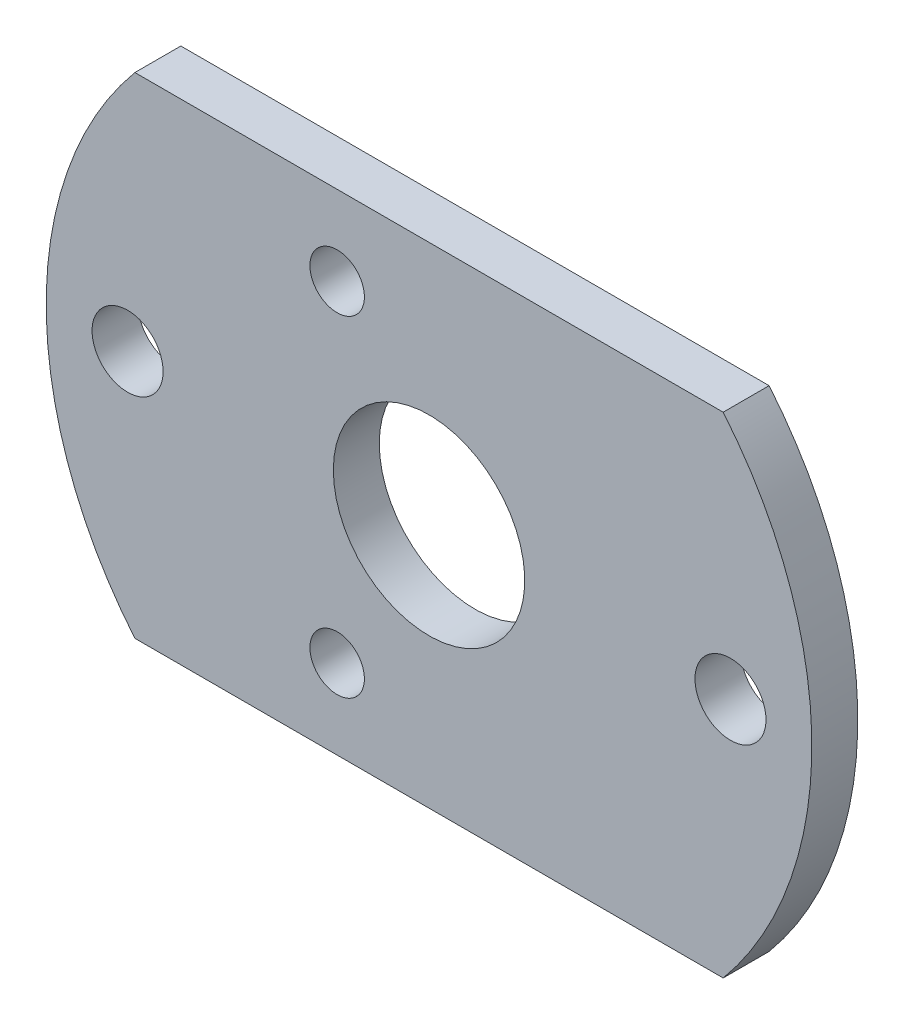
ISO-10303-21;
HEADER;
FILE_DESCRIPTION(('STEP AP214'),'2;1');
FILE_NAME('part.step','',(''),(''),'','','');
FILE_SCHEMA(('AUTOMOTIVE_DESIGN { 1 0 10303 214 1 1 1 1 }'));
ENDSEC;
DATA;
#1=APPLICATION_CONTEXT('core data for automotive mechanical design processes');
#2=APPLICATION_PROTOCOL_DEFINITION('international standard','automotive_design',2000,#1);
#3=PRODUCT_CONTEXT('',#1,'mechanical');
#4=PRODUCT('Part','Part','',(#3));
#5=PRODUCT_RELATED_PRODUCT_CATEGORY('part','',(#4));
#6=PRODUCT_DEFINITION_FORMATION('','',#4);
#7=PRODUCT_DEFINITION_CONTEXT('part definition',#1,'design');
#8=PRODUCT_DEFINITION('design','',#6,#7);
#9=PRODUCT_DEFINITION_SHAPE('','',#8);
#10=(LENGTH_UNIT() NAMED_UNIT(*) SI_UNIT(.MILLI.,.METRE.));
#11=(NAMED_UNIT(*) PLANE_ANGLE_UNIT() SI_UNIT($,.RADIAN.));
#12=(NAMED_UNIT(*) SI_UNIT($,.STERADIAN.) SOLID_ANGLE_UNIT());
#13=UNCERTAINTY_MEASURE_WITH_UNIT(LENGTH_MEASURE(1.E-05),#10,'distance_accuracy_value','');
#14=(GEOMETRIC_REPRESENTATION_CONTEXT(3) GLOBAL_UNCERTAINTY_ASSIGNED_CONTEXT((#13)) GLOBAL_UNIT_ASSIGNED_CONTEXT((#10,
#11,#12)) REPRESENTATION_CONTEXT('',''));
#15=CARTESIAN_POINT('',(0.,0.,0.));
#16=DIRECTION('',(0.,0.,1.));
#17=DIRECTION('',(1.,0.,0.));
#18=AXIS2_PLACEMENT_3D('',#15,#16,#17);
#19=CARTESIAN_POINT('',(0.,0.,1.905));
#20=DIRECTION('',(0.,0.,-1.));
#21=DIRECTION('',(-1.,0.,0.));
#22=AXIS2_PLACEMENT_3D('',#19,#20,#21);
#23=CYLINDRICAL_SURFACE('',#22,15.875);
#24=CARTESIAN_POINT('',(0.,0.,1.905));
#25=DIRECTION('',(0.,0.,1.));
#26=DIRECTION('',(1.,0.,0.));
#27=AXIS2_PLACEMENT_3D('',#24,#25,#26);
#28=CIRCLE('',#27,15.875);
#29=CARTESIAN_POINT('',(-12.1979516723096,10.16,1.905));
#30=VERTEX_POINT('',#29);
#31=CARTESIAN_POINT('',(-12.1979516723096,-10.16,1.905));
#32=VERTEX_POINT('',#31);
#33=EDGE_CURVE('E46',#30,#32,#28,.T.);
#34=ORIENTED_EDGE('',*,*,#33,.F.);
#35=DIRECTION('',(0.,0.,1.));
#36=VECTOR('',#35,1.);
#37=CARTESIAN_POINT('',(-12.1979516723096,10.16,0.));
#38=LINE('',#37,#36);
#39=CARTESIAN_POINT('',(-12.1979516723096,10.16,0.));
#40=VERTEX_POINT('',#39);
#41=EDGE_CURVE('E80',#40,#30,#38,.T.);
#42=ORIENTED_EDGE('',*,*,#41,.F.);
#43=CARTESIAN_POINT('',(0.,0.,0.));
#44=DIRECTION('',(0.,0.,1.));
#45=DIRECTION('',(1.,0.,0.));
#46=AXIS2_PLACEMENT_3D('',#43,#44,#45);
#47=CIRCLE('',#46,15.875);
#48=CARTESIAN_POINT('',(-12.1979516723096,-10.16,0.));
#49=VERTEX_POINT('',#48);
#50=EDGE_CURVE('E89',#40,#49,#47,.T.);
#51=ORIENTED_EDGE('',*,*,#50,.T.);
#52=DIRECTION('',(0.,0.,1.));
#53=VECTOR('',#52,1.);
#54=CARTESIAN_POINT('',(-12.1979516723096,-10.16,0.));
#55=LINE('',#54,#53);
#56=EDGE_CURVE('E129',#49,#32,#55,.T.);
#57=ORIENTED_EDGE('',*,*,#56,.T.);
#58=EDGE_LOOP('',(#34,#42,#51,#57));
#59=FACE_BOUND('',#58,.T.);
#60=ADVANCED_FACE('F37',(#59),#23,.T.);
#61=CARTESIAN_POINT('',(0.,0.,1.905));
#62=DIRECTION('',(0.,0.,1.));
#63=DIRECTION('',(1.,0.,0.));
#64=AXIS2_PLACEMENT_3D('',#61,#62,#63);
#65=PLANE('',#64);
#66=DIRECTION('',(1.,0.,0.));
#67=VECTOR('',#66,1.);
#68=CARTESIAN_POINT('',(-12.1979516723096,10.16,1.905));
#69=LINE('',#68,#67);
#70=CARTESIAN_POINT('',(12.1979516723096,10.16,1.905));
#71=VERTEX_POINT('',#70);
#72=EDGE_CURVE('E53',#30,#71,#69,.T.);
#73=ORIENTED_EDGE('',*,*,#72,.F.);
#74=ORIENTED_EDGE('',*,*,#33,.T.);
#75=DIRECTION('',(-1.,0.,0.));
#76=VECTOR('',#75,1.);
#77=CARTESIAN_POINT('',(-12.1979516723096,-10.16,1.905));
#78=LINE('',#77,#76);
#79=CARTESIAN_POINT('',(12.1979516723096,-10.16,1.905));
#80=VERTEX_POINT('',#79);
#81=EDGE_CURVE('E133',#80,#32,#78,.T.);
#82=ORIENTED_EDGE('',*,*,#81,.F.);
#83=EDGE_CURVE('E11',#80,#71,#28,.T.);
#84=ORIENTED_EDGE('',*,*,#83,.T.);
#85=EDGE_LOOP('',(#73,#74,#82,#84));
#86=FACE_BOUND('',#85,.T.);
#87=CARTESIAN_POINT('',(-3.81,6.858,1.905));
#88=DIRECTION('',(0.,0.,1.));
#89=DIRECTION('',(1.,0.,0.));
#90=AXIS2_PLACEMENT_3D('',#87,#88,#89);
#91=CIRCLE('',#90,1.13029999999999);
#92=CARTESIAN_POINT('',(-2.67970000000001,6.858,1.905));
#93=VERTEX_POINT('',#92);
#94=EDGE_CURVE('E126',#93,#93,#91,.T.);
#95=ORIENTED_EDGE('',*,*,#94,.F.);
#96=EDGE_LOOP('',(#95));
#97=FACE_BOUND('',#96,.T.);
#98=CARTESIAN_POINT('',(-3.81,-6.858,1.905));
#99=DIRECTION('',(0.,0.,1.));
#100=DIRECTION('',(1.,0.,0.));
#101=AXIS2_PLACEMENT_3D('',#98,#99,#100);
#102=CIRCLE('',#101,1.13029999999999);
#103=CARTESIAN_POINT('',(-2.67970000000001,-6.858,1.905));
#104=VERTEX_POINT('',#103);
#105=EDGE_CURVE('E120',#104,#104,#102,.T.);
#106=ORIENTED_EDGE('',*,*,#105,.F.);
#107=EDGE_LOOP('',(#106));
#108=FACE_BOUND('',#107,.T.);
#109=CARTESIAN_POINT('',(-12.5,0.,1.905));
#110=DIRECTION('',(0.,0.,1.));
#111=DIRECTION('',(1.,0.,0.));
#112=AXIS2_PLACEMENT_3D('',#109,#110,#111);
#113=CIRCLE('',#112,1.47319999999999);
#114=CARTESIAN_POINT('',(-11.0268,0.,1.905));
#115=VERTEX_POINT('',#114);
#116=EDGE_CURVE('E114',#115,#115,#113,.T.);
#117=ORIENTED_EDGE('',*,*,#116,.F.);
#118=EDGE_LOOP('',(#117));
#119=FACE_BOUND('',#118,.T.);
#120=CARTESIAN_POINT('',(12.5,0.,1.905));
#121=DIRECTION('',(0.,0.,1.));
#122=DIRECTION('',(1.,0.,0.));
#123=AXIS2_PLACEMENT_3D('',#120,#121,#122);
#124=CIRCLE('',#123,1.47319999999999);
#125=CARTESIAN_POINT('',(13.9732,0.,1.905));
#126=VERTEX_POINT('',#125);
#127=EDGE_CURVE('E108',#126,#126,#124,.T.);
#128=ORIENTED_EDGE('',*,*,#127,.F.);
#129=EDGE_LOOP('',(#128));
#130=FACE_BOUND('',#129,.T.);
#131=CARTESIAN_POINT('',(0.,0.,1.905));
#132=DIRECTION('',(0.,0.,1.));
#133=DIRECTION('',(1.,0.,0.));
#134=AXIS2_PLACEMENT_3D('',#131,#132,#133);
#135=CIRCLE('',#134,3.96875);
#136=CARTESIAN_POINT('',(-3.96875,0.,1.905));
#137=VERTEX_POINT('',#136);
#138=EDGE_CURVE('E96',#137,#137,#135,.T.);
#139=ORIENTED_EDGE('',*,*,#138,.F.);
#140=EDGE_LOOP('',(#139));
#141=FACE_BOUND('',#140,.T.);
#142=ADVANCED_FACE('F140',(#86,#97,#108,#119,#130,#141),#65,.T.);
#143=CARTESIAN_POINT('',(0.,0.,0.));
#144=DIRECTION('',(0.,0.,1.));
#145=DIRECTION('',(1.,0.,0.));
#146=AXIS2_PLACEMENT_3D('',#143,#144,#145);
#147=PLANE('',#146);
#148=CARTESIAN_POINT('',(-3.81,6.858,0.));
#149=DIRECTION('',(0.,0.,1.));
#150=DIRECTION('',(1.,0.,0.));
#151=AXIS2_PLACEMENT_3D('',#148,#149,#150);
#152=CIRCLE('',#151,1.1303);
#153=CARTESIAN_POINT('',(-2.6797,6.858,0.));
#154=VERTEX_POINT('',#153);
#155=EDGE_CURVE('E123',#154,#154,#152,.T.);
#156=ORIENTED_EDGE('',*,*,#155,.T.);
#157=EDGE_LOOP('',(#156));
#158=FACE_BOUND('',#157,.T.);
#159=CARTESIAN_POINT('',(-3.81,-6.858,0.));
#160=DIRECTION('',(0.,0.,1.));
#161=DIRECTION('',(1.,0.,0.));
#162=AXIS2_PLACEMENT_3D('',#159,#160,#161);
#163=CIRCLE('',#162,1.1303);
#164=CARTESIAN_POINT('',(-2.6797,-6.858,0.));
#165=VERTEX_POINT('',#164);
#166=EDGE_CURVE('E117',#165,#165,#163,.T.);
#167=ORIENTED_EDGE('',*,*,#166,.T.);
#168=EDGE_LOOP('',(#167));
#169=FACE_BOUND('',#168,.T.);
#170=CARTESIAN_POINT('',(-12.5,0.,0.));
#171=DIRECTION('',(0.,0.,1.));
#172=DIRECTION('',(1.,0.,0.));
#173=AXIS2_PLACEMENT_3D('',#170,#171,#172);
#174=CIRCLE('',#173,1.4732);
#175=CARTESIAN_POINT('',(-11.0268,0.,0.));
#176=VERTEX_POINT('',#175);
#177=EDGE_CURVE('E111',#176,#176,#174,.T.);
#178=ORIENTED_EDGE('',*,*,#177,.T.);
#179=EDGE_LOOP('',(#178));
#180=FACE_BOUND('',#179,.T.);
#181=CARTESIAN_POINT('',(12.5,0.,0.));
#182=DIRECTION('',(0.,0.,1.));
#183=DIRECTION('',(1.,0.,0.));
#184=AXIS2_PLACEMENT_3D('',#181,#182,#183);
#185=CIRCLE('',#184,1.4732);
#186=CARTESIAN_POINT('',(13.9732,0.,0.));
#187=VERTEX_POINT('',#186);
#188=EDGE_CURVE('E103',#187,#187,#185,.T.);
#189=ORIENTED_EDGE('',*,*,#188,.T.);
#190=EDGE_LOOP('',(#189));
#191=FACE_BOUND('',#190,.T.);
#192=ORIENTED_EDGE('',*,*,#50,.F.);
#193=DIRECTION('',(1.,0.,0.));
#194=VECTOR('',#193,1.);
#195=CARTESIAN_POINT('',(-12.1979516723096,10.16,0.));
#196=LINE('',#195,#194);
#197=CARTESIAN_POINT('',(12.1979516723096,10.16,0.));
#198=VERTEX_POINT('',#197);
#199=EDGE_CURVE('E77',#40,#198,#196,.T.);
#200=ORIENTED_EDGE('',*,*,#199,.T.);
#201=CARTESIAN_POINT('',(12.1979516723096,-10.16,0.));
#202=VERTEX_POINT('',#201);
#203=EDGE_CURVE('E41',#202,#198,#47,.T.);
#204=ORIENTED_EDGE('',*,*,#203,.F.);
#205=DIRECTION('',(-1.,0.,0.));
#206=VECTOR('',#205,1.);
#207=CARTESIAN_POINT('',(-12.1979516723096,-10.16,0.));
#208=LINE('',#207,#206);
#209=EDGE_CURVE('E95',#202,#49,#208,.T.);
#210=ORIENTED_EDGE('',*,*,#209,.T.);
#211=EDGE_LOOP('',(#192,#200,#204,#210));
#212=FACE_BOUND('',#211,.T.);
#213=CARTESIAN_POINT('',(0.,0.,0.));
#214=DIRECTION('',(0.,0.,1.));
#215=DIRECTION('',(1.,0.,0.));
#216=AXIS2_PLACEMENT_3D('',#213,#214,#215);
#217=CIRCLE('',#216,3.96875);
#218=CARTESIAN_POINT('',(-3.96875,0.,0.));
#219=VERTEX_POINT('',#218);
#220=EDGE_CURVE('E98',#219,#219,#217,.T.);
#221=ORIENTED_EDGE('',*,*,#220,.T.);
#222=EDGE_LOOP('',(#221));
#223=FACE_BOUND('',#222,.T.);
#224=ADVANCED_FACE('F93',(#158,#169,#180,#191,#212,#223),#147,.F.);
#225=ORIENTED_EDGE('',*,*,#203,.T.);
#226=DIRECTION('',(0.,0.,1.));
#227=VECTOR('',#226,1.);
#228=CARTESIAN_POINT('',(12.1979516723096,10.16,0.));
#229=LINE('',#228,#227);
#230=EDGE_CURVE('E81',#198,#71,#229,.T.);
#231=ORIENTED_EDGE('',*,*,#230,.T.);
#232=ORIENTED_EDGE('',*,*,#83,.F.);
#233=DIRECTION('',(0.,0.,1.));
#234=VECTOR('',#233,1.);
#235=CARTESIAN_POINT('',(12.1979516723096,-10.16,0.));
#236=LINE('',#235,#234);
#237=EDGE_CURVE('E130',#202,#80,#236,.T.);
#238=ORIENTED_EDGE('',*,*,#237,.F.);
#239=EDGE_LOOP('',(#225,#231,#232,#238));
#240=FACE_BOUND('',#239,.T.);
#241=ADVANCED_FACE('F39',(#240),#23,.T.);
#242=CARTESIAN_POINT('',(0.,0.,1.905));
#243=DIRECTION('',(0.,0.,-1.));
#244=DIRECTION('',(-1.,0.,0.));
#245=AXIS2_PLACEMENT_3D('',#242,#243,#244);
#246=CYLINDRICAL_SURFACE('',#245,3.96875);
#247=CARTESIAN_POINT('',(-3.96875,0.,1.905));
#248=CARTESIAN_POINT('',(-3.96875,0.,1.88515625));
#249=CARTESIAN_POINT('',(-3.96875,0.,1.8653125));
#250=CARTESIAN_POINT('',(-3.96875,0.,1.825625));
#251=CARTESIAN_POINT('',(-3.96875,0.,1.80578125));
#252=CARTESIAN_POINT('',(-3.96875,0.,1.76609375));
#253=CARTESIAN_POINT('',(-3.96875,0.,1.74625));
#254=CARTESIAN_POINT('',(-3.96875,0.,1.7065625));
#255=CARTESIAN_POINT('',(-3.96875,0.,1.68671875));
#256=CARTESIAN_POINT('',(-3.96875,0.,1.64703125));
#257=CARTESIAN_POINT('',(-3.96875,0.,1.6271875));
#258=CARTESIAN_POINT('',(-3.96875,0.,1.5875));
#259=CARTESIAN_POINT('',(-3.96875,0.,1.56765625));
#260=CARTESIAN_POINT('',(-3.96875,0.,1.52796875));
#261=CARTESIAN_POINT('',(-3.96875,0.,1.508125));
#262=CARTESIAN_POINT('',(-3.96875,0.,1.4684375));
#263=CARTESIAN_POINT('',(-3.96875,0.,1.44859375));
#264=CARTESIAN_POINT('',(-3.96875,0.,1.40890625));
#265=CARTESIAN_POINT('',(-3.96875,0.,1.3890625));
#266=CARTESIAN_POINT('',(-3.96875,0.,1.349375));
#267=CARTESIAN_POINT('',(-3.96875,0.,1.32953125));
#268=CARTESIAN_POINT('',(-3.96875,0.,1.28984375));
#269=CARTESIAN_POINT('',(-3.96875,0.,1.27));
#270=CARTESIAN_POINT('',(-3.96875,0.,1.2303125));
#271=CARTESIAN_POINT('',(-3.96875,0.,1.21046875));
#272=CARTESIAN_POINT('',(-3.96875,0.,1.17078125));
#273=CARTESIAN_POINT('',(-3.96875,0.,1.1509375));
#274=CARTESIAN_POINT('',(-3.96875,0.,1.11125));
#275=CARTESIAN_POINT('',(-3.96875,0.,1.09140625));
#276=CARTESIAN_POINT('',(-3.96875,0.,1.05171875));
#277=CARTESIAN_POINT('',(-3.96875,0.,1.031875));
#278=CARTESIAN_POINT('',(-3.96875,0.,0.9921875));
#279=CARTESIAN_POINT('',(-3.96875,0.,0.97234375));
#280=CARTESIAN_POINT('',(-3.96875,0.,0.93265625));
#281=CARTESIAN_POINT('',(-3.96875,0.,0.9128125));
#282=CARTESIAN_POINT('',(-3.96875,0.,0.873125));
#283=CARTESIAN_POINT('',(-3.96875,0.,0.85328125));
#284=CARTESIAN_POINT('',(-3.96875,0.,0.81359375));
#285=CARTESIAN_POINT('',(-3.96875,0.,0.79375));
#286=CARTESIAN_POINT('',(-3.96875,0.,0.7540625));
#287=CARTESIAN_POINT('',(-3.96875,0.,0.73421875));
#288=CARTESIAN_POINT('',(-3.96875,0.,0.69453125));
#289=CARTESIAN_POINT('',(-3.96875,0.,0.6746875));
#290=CARTESIAN_POINT('',(-3.96875,0.,0.635));
#291=CARTESIAN_POINT('',(-3.96875,0.,0.61515625));
#292=CARTESIAN_POINT('',(-3.96875,0.,0.57546875));
#293=CARTESIAN_POINT('',(-3.96875,0.,0.555625));
#294=CARTESIAN_POINT('',(-3.96875,0.,0.5159375));
#295=CARTESIAN_POINT('',(-3.96875,0.,0.49609375));
#296=CARTESIAN_POINT('',(-3.96875,0.,0.45640625));
#297=CARTESIAN_POINT('',(-3.96875,0.,0.4365625));
#298=CARTESIAN_POINT('',(-3.96875,0.,0.396875));
#299=CARTESIAN_POINT('',(-3.96875,0.,0.37703125));
#300=CARTESIAN_POINT('',(-3.96875,0.,0.33734375));
#301=CARTESIAN_POINT('',(-3.96875,0.,0.3175));
#302=CARTESIAN_POINT('',(-3.96875,0.,0.2778125));
#303=CARTESIAN_POINT('',(-3.96875,0.,0.25796875));
#304=CARTESIAN_POINT('',(-3.96875,0.,0.21828125));
#305=CARTESIAN_POINT('',(-3.96875,0.,0.1984375));
#306=CARTESIAN_POINT('',(-3.96875,0.,0.15875));
#307=CARTESIAN_POINT('',(-3.96875,0.,0.13890625));
#308=CARTESIAN_POINT('',(-3.96875,0.,0.09921875));
#309=CARTESIAN_POINT('',(-3.96875,0.,0.0793749999999999));
#310=CARTESIAN_POINT('',(-3.96875,0.,0.0396874999999999));
#311=CARTESIAN_POINT('',(-3.96875,0.,0.01984375));
#312=CARTESIAN_POINT('',(-3.96875,0.,0.));
#313=B_SPLINE_CURVE_WITH_KNOTS('',3,(#247,#248,#249,#250,#251,#252,#253,#254,#255,#256,#257,
#258,#259,#260,#261,#262,#263,#264,#265,#266,#267,#268,#269,#270,#271,#272,#273,#274,#275,#276,
#277,#278,#279,#280,#281,#282,#283,#284,#285,#286,#287,#288,#289,#290,#291,#292,#293,#294,#295,
#296,#297,#298,#299,#300,#301,#302,#303,#304,#305,#306,#307,#308,#309,#310,#311,#312),
.UNSPECIFIED.,.F.,.F.,(4,2,2,2,2,2,2,2,2,2,2,2,2,2,2,2,2,2,2,2,2,2,2,2,2,2,2,2,2,2,2,2,4),(0.,
0.0595312499999999,0.1190625,0.17859375,0.238125,0.29765625,0.3571875,0.41671875,0.47625,
0.53578125,0.5953125,0.65484375,0.714375,0.77390625,0.833437499999999,0.89296875,0.9525,
1.01203125,1.0715625,1.13109375,1.190625,1.25015625,1.3096875,1.36921875,1.42875,1.48828125,
1.5478125,1.60734375,1.666875,1.72640625,1.7859375,1.84546875,1.905),.UNSPECIFIED.);
#314=EDGE_CURVE('BSEAM161',#137,#219,#313,.T.);
#315=ORIENTED_EDGE('',*,*,#138,.T.);
#316=ORIENTED_EDGE('',*,*,#220,.F.);
#317=ORIENTED_EDGE('',*,*,#314,.T.);
#318=ORIENTED_EDGE('',*,*,#314,.F.);
#319=EDGE_LOOP('',(#315,#317,#316,#318));
#320=FACE_BOUND('',#319,.T.);
#321=ADVANCED_FACE('F161',(#320),#246,.F.);
#322=CARTESIAN_POINT('',(12.5,0.,1.905));
#323=DIRECTION('',(0.,0.,1.));
#324=DIRECTION('',(1.,0.,0.));
#325=AXIS2_PLACEMENT_3D('',#322,#323,#324);
#326=CYLINDRICAL_SURFACE('',#325,1.47319999999999);
#327=ORIENTED_EDGE('',*,*,#188,.F.);
#328=EDGE_LOOP('',(#327));
#329=FACE_BOUND('',#328,.T.);
#330=ORIENTED_EDGE('',*,*,#127,.T.);
#331=EDGE_LOOP('',(#330));
#332=FACE_BOUND('',#331,.T.);
#333=ADVANCED_FACE('F166',(#329,#332),#326,.F.);
#334=CARTESIAN_POINT('',(-12.5,0.,1.905));
#335=DIRECTION('',(0.,0.,1.));
#336=DIRECTION('',(1.,0.,0.));
#337=AXIS2_PLACEMENT_3D('',#334,#335,#336);
#338=CYLINDRICAL_SURFACE('',#337,1.47319999999999);
#339=ORIENTED_EDGE('',*,*,#177,.F.);
#340=EDGE_LOOP('',(#339));
#341=FACE_BOUND('',#340,.T.);
#342=ORIENTED_EDGE('',*,*,#116,.T.);
#343=EDGE_LOOP('',(#342));
#344=FACE_BOUND('',#343,.T.);
#345=ADVANCED_FACE('F175',(#341,#344),#338,.F.);
#346=CARTESIAN_POINT('',(-3.81,-6.858,1.905));
#347=DIRECTION('',(0.,0.,1.));
#348=DIRECTION('',(1.,0.,0.));
#349=AXIS2_PLACEMENT_3D('',#346,#347,#348);
#350=CYLINDRICAL_SURFACE('',#349,1.13029999999999);
#351=ORIENTED_EDGE('',*,*,#166,.F.);
#352=EDGE_LOOP('',(#351));
#353=FACE_BOUND('',#352,.T.);
#354=ORIENTED_EDGE('',*,*,#105,.T.);
#355=EDGE_LOOP('',(#354));
#356=FACE_BOUND('',#355,.T.);
#357=ADVANCED_FACE('F152',(#353,#356),#350,.F.);
#358=CARTESIAN_POINT('',(-3.81,6.858,1.905));
#359=DIRECTION('',(0.,0.,1.));
#360=DIRECTION('',(1.,0.,0.));
#361=AXIS2_PLACEMENT_3D('',#358,#359,#360);
#362=CYLINDRICAL_SURFACE('',#361,1.13029999999999);
#363=ORIENTED_EDGE('',*,*,#155,.F.);
#364=EDGE_LOOP('',(#363));
#365=FACE_BOUND('',#364,.T.);
#366=ORIENTED_EDGE('',*,*,#94,.T.);
#367=EDGE_LOOP('',(#366));
#368=FACE_BOUND('',#367,.T.);
#369=ADVANCED_FACE('F145',(#365,#368),#362,.F.);
#370=CARTESIAN_POINT('',(-12.1979516723096,-10.16,0.));
#371=DIRECTION('',(0.,1.,0.));
#372=DIRECTION('',(0.,0.,1.));
#373=AXIS2_PLACEMENT_3D('',#370,#371,#372);
#374=PLANE('',#373);
#375=ORIENTED_EDGE('',*,*,#81,.T.);
#376=ORIENTED_EDGE('',*,*,#56,.F.);
#377=ORIENTED_EDGE('',*,*,#209,.F.);
#378=ORIENTED_EDGE('',*,*,#237,.T.);
#379=EDGE_LOOP('',(#375,#376,#377,#378));
#380=FACE_BOUND('',#379,.T.);
#381=ADVANCED_FACE('F143',(#380),#374,.F.);
#382=CARTESIAN_POINT('',(-12.1979516723096,10.16,0.));
#383=DIRECTION('',(0.,-1.,0.));
#384=DIRECTION('',(0.,0.,-1.));
#385=AXIS2_PLACEMENT_3D('',#382,#383,#384);
#386=PLANE('',#385);
#387=ORIENTED_EDGE('',*,*,#72,.T.);
#388=ORIENTED_EDGE('',*,*,#230,.F.);
#389=ORIENTED_EDGE('',*,*,#199,.F.);
#390=ORIENTED_EDGE('',*,*,#41,.T.);
#391=EDGE_LOOP('',(#387,#388,#389,#390));
#392=FACE_BOUND('',#391,.T.);
#393=ADVANCED_FACE('F79',(#392),#386,.F.);
#394=CLOSED_SHELL('',(#60,#142,#224,#241,#321,#333,#345,#357,#369,#381,#393));
#395=MANIFOLD_SOLID_BREP('B2',#394);
#396=ADVANCED_BREP_SHAPE_REPRESENTATION('',(#18,#395),#14);
#397=SHAPE_DEFINITION_REPRESENTATION(#9,#396);
ENDSEC;
END-ISO-10303-21;
